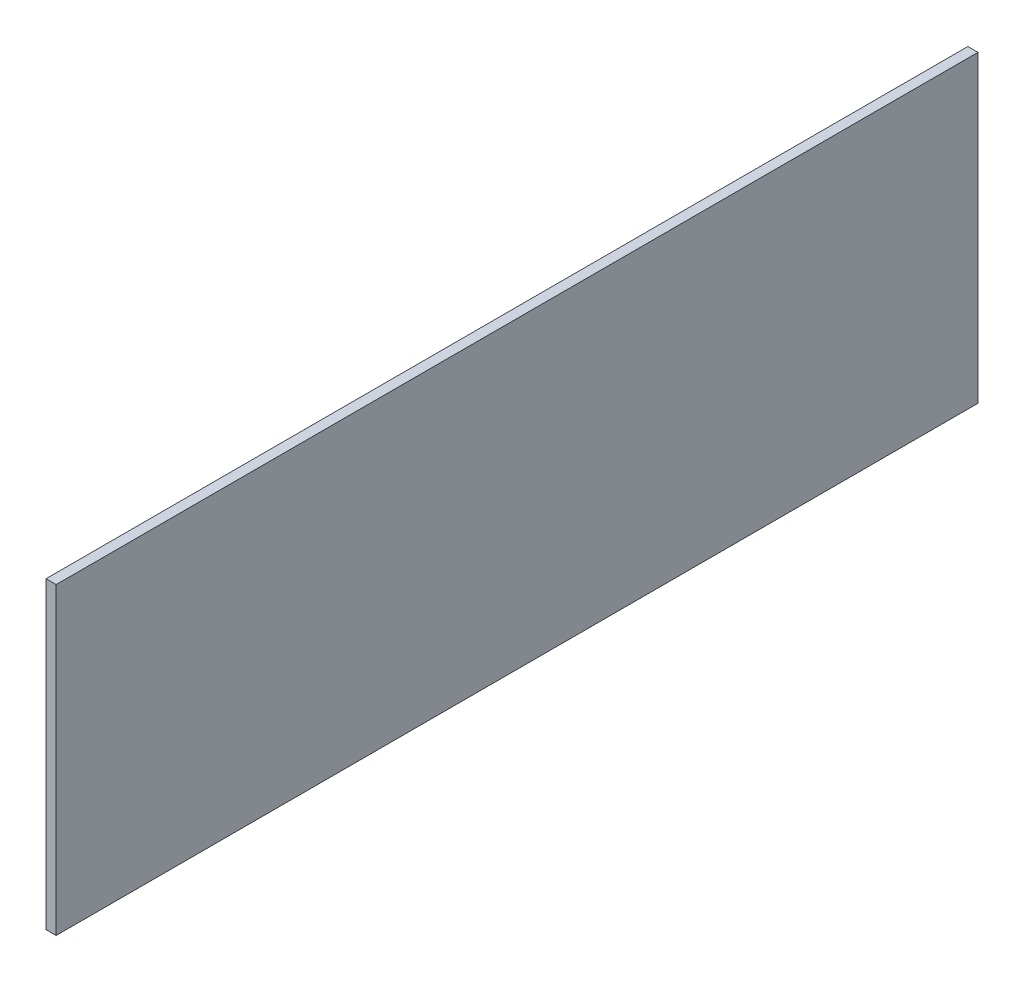
ISO-10303-21;
HEADER;
FILE_DESCRIPTION(('STEP AP214'),'2;1');
FILE_NAME('part.step','',(''),(''),'','','');
FILE_SCHEMA(('AUTOMOTIVE_DESIGN { 1 0 10303 214 1 1 1 1 }'));
ENDSEC;
DATA;
#1=APPLICATION_CONTEXT('core data for automotive mechanical design processes');
#2=APPLICATION_PROTOCOL_DEFINITION('international standard','automotive_design',2000,#1);
#3=PRODUCT_CONTEXT('',#1,'mechanical');
#4=PRODUCT('Part','Part','',(#3));
#5=PRODUCT_RELATED_PRODUCT_CATEGORY('part','',(#4));
#6=PRODUCT_DEFINITION_FORMATION('','',#4);
#7=PRODUCT_DEFINITION_CONTEXT('part definition',#1,'design');
#8=PRODUCT_DEFINITION('design','',#6,#7);
#9=PRODUCT_DEFINITION_SHAPE('','',#8);
#10=(LENGTH_UNIT() NAMED_UNIT(*) SI_UNIT(.MILLI.,.METRE.));
#11=(NAMED_UNIT(*) PLANE_ANGLE_UNIT() SI_UNIT($,.RADIAN.));
#12=(NAMED_UNIT(*) SI_UNIT($,.STERADIAN.) SOLID_ANGLE_UNIT());
#13=UNCERTAINTY_MEASURE_WITH_UNIT(LENGTH_MEASURE(1.E-05),#10,'distance_accuracy_value','');
#14=(GEOMETRIC_REPRESENTATION_CONTEXT(3) GLOBAL_UNCERTAINTY_ASSIGNED_CONTEXT((#13)) GLOBAL_UNIT_ASSIGNED_CONTEXT((#10,
#11,#12)) REPRESENTATION_CONTEXT('',''));
#15=CARTESIAN_POINT('',(0.,0.,0.));
#16=DIRECTION('',(0.,0.,1.));
#17=DIRECTION('',(1.,0.,0.));
#18=AXIS2_PLACEMENT_3D('',#15,#16,#17);
#19=CARTESIAN_POINT('',(62.,60.,-92.));
#20=DIRECTION('',(0.,0.,-1.));
#21=DIRECTION('',(0.,1.,0.));
#22=AXIS2_PLACEMENT_3D('',#19,#20,#21);
#23=PLANE('',#22);
#24=DIRECTION('',(0.,-1.,0.));
#25=VECTOR('',#24,1.);
#26=CARTESIAN_POINT('',(60.,60.,-92.));
#27=LINE('',#26,#25);
#28=CARTESIAN_POINT('',(60.,60.,-92.));
#29=VERTEX_POINT('',#28);
#30=CARTESIAN_POINT('',(60.,0.,-92.));
#31=VERTEX_POINT('',#30);
#32=EDGE_CURVE('E133',#29,#31,#27,.T.);
#33=ORIENTED_EDGE('',*,*,#32,.F.);
#34=DIRECTION('',(-1.,0.,0.));
#35=VECTOR('',#34,1.);
#36=CARTESIAN_POINT('',(62.,60.,-92.));
#37=LINE('',#36,#35);
#38=CARTESIAN_POINT('',(62.,60.,-92.));
#39=VERTEX_POINT('',#38);
#40=EDGE_CURVE('E12',#39,#29,#37,.T.);
#41=ORIENTED_EDGE('',*,*,#40,.F.);
#42=DIRECTION('',(0.,-1.,0.));
#43=VECTOR('',#42,1.);
#44=CARTESIAN_POINT('',(62.,60.,-92.));
#45=LINE('',#44,#43);
#46=CARTESIAN_POINT('',(62.,0.,-92.));
#47=VERTEX_POINT('',#46);
#48=EDGE_CURVE('E117',#39,#47,#45,.T.);
#49=ORIENTED_EDGE('',*,*,#48,.T.);
#50=DIRECTION('',(-1.,0.,0.));
#51=VECTOR('',#50,1.);
#52=CARTESIAN_POINT('',(62.,0.,-92.));
#53=LINE('',#52,#51);
#54=EDGE_CURVE('E47',#47,#31,#53,.T.);
#55=ORIENTED_EDGE('',*,*,#54,.T.);
#56=EDGE_LOOP('',(#33,#41,#49,#55));
#57=FACE_BOUND('',#56,.T.);
#58=ADVANCED_FACE('F43',(#57),#23,.T.);
#59=CARTESIAN_POINT('',(62.,60.,-92.));
#60=DIRECTION('',(0.,-1.,0.));
#61=DIRECTION('',(0.,0.,-1.));
#62=AXIS2_PLACEMENT_3D('',#59,#60,#61);
#63=PLANE('',#62);
#64=DIRECTION('',(0.,0.,1.));
#65=VECTOR('',#64,1.);
#66=CARTESIAN_POINT('',(60.,60.,-92.));
#67=LINE('',#66,#65);
#68=CARTESIAN_POINT('',(60.,60.,90.));
#69=VERTEX_POINT('',#68);
#70=EDGE_CURVE('E85',#29,#69,#67,.T.);
#71=ORIENTED_EDGE('',*,*,#70,.T.);
#72=DIRECTION('',(-1.,0.,0.));
#73=VECTOR('',#72,1.);
#74=CARTESIAN_POINT('',(62.,60.,90.));
#75=LINE('',#74,#73);
#76=CARTESIAN_POINT('',(62.,60.,90.));
#77=VERTEX_POINT('',#76);
#78=EDGE_CURVE('E55',#77,#69,#75,.T.);
#79=ORIENTED_EDGE('',*,*,#78,.F.);
#80=DIRECTION('',(0.,0.,1.));
#81=VECTOR('',#80,1.);
#82=CARTESIAN_POINT('',(62.,60.,-92.));
#83=LINE('',#82,#81);
#84=EDGE_CURVE('E104',#39,#77,#83,.T.);
#85=ORIENTED_EDGE('',*,*,#84,.F.);
#86=ORIENTED_EDGE('',*,*,#40,.T.);
#87=EDGE_LOOP('',(#71,#79,#85,#86));
#88=FACE_BOUND('',#87,.T.);
#89=ADVANCED_FACE('F159',(#88),#63,.F.);
#90=CARTESIAN_POINT('',(62.,60.,90.));
#91=DIRECTION('',(0.,0.,-1.));
#92=DIRECTION('',(-1.,0.,0.));
#93=AXIS2_PLACEMENT_3D('',#90,#91,#92);
#94=PLANE('',#93);
#95=DIRECTION('',(0.,-1.,0.));
#96=VECTOR('',#95,1.);
#97=CARTESIAN_POINT('',(60.,60.,90.));
#98=LINE('',#97,#96);
#99=CARTESIAN_POINT('',(60.,0.,90.));
#100=VERTEX_POINT('',#99);
#101=EDGE_CURVE('E112',#69,#100,#98,.T.);
#102=ORIENTED_EDGE('',*,*,#101,.T.);
#103=DIRECTION('',(-1.,0.,0.));
#104=VECTOR('',#103,1.);
#105=CARTESIAN_POINT('',(62.,0.,90.));
#106=LINE('',#105,#104);
#107=CARTESIAN_POINT('',(62.,0.,90.));
#108=VERTEX_POINT('',#107);
#109=EDGE_CURVE('E109',#108,#100,#106,.T.);
#110=ORIENTED_EDGE('',*,*,#109,.F.);
#111=DIRECTION('',(0.,-1.,0.));
#112=VECTOR('',#111,1.);
#113=CARTESIAN_POINT('',(62.,60.,90.));
#114=LINE('',#113,#112);
#115=EDGE_CURVE('E99',#77,#108,#114,.T.);
#116=ORIENTED_EDGE('',*,*,#115,.F.);
#117=ORIENTED_EDGE('',*,*,#78,.T.);
#118=EDGE_LOOP('',(#102,#110,#116,#117));
#119=FACE_BOUND('',#118,.T.);
#120=ADVANCED_FACE('F110',(#119),#94,.F.);
#121=CARTESIAN_POINT('',(62.,0.,-92.));
#122=DIRECTION('',(0.,-1.,0.));
#123=DIRECTION('',(0.,0.,-1.));
#124=AXIS2_PLACEMENT_3D('',#121,#122,#123);
#125=PLANE('',#124);
#126=DIRECTION('',(0.,0.,1.));
#127=VECTOR('',#126,1.);
#128=CARTESIAN_POINT('',(60.,0.,-92.));
#129=LINE('',#128,#127);
#130=EDGE_CURVE('E137',#31,#100,#129,.T.);
#131=ORIENTED_EDGE('',*,*,#130,.F.);
#132=ORIENTED_EDGE('',*,*,#54,.F.);
#133=DIRECTION('',(0.,0.,1.));
#134=VECTOR('',#133,1.);
#135=CARTESIAN_POINT('',(62.,0.,-92.));
#136=LINE('',#135,#134);
#137=EDGE_CURVE('E103',#47,#108,#136,.T.);
#138=ORIENTED_EDGE('',*,*,#137,.T.);
#139=ORIENTED_EDGE('',*,*,#109,.T.);
#140=EDGE_LOOP('',(#131,#132,#138,#139));
#141=FACE_BOUND('',#140,.T.);
#142=ADVANCED_FACE('F115',(#141),#125,.T.);
#143=CARTESIAN_POINT('',(62.,0.,0.));
#144=DIRECTION('',(-1.,0.,0.));
#145=DIRECTION('',(0.,0.,1.));
#146=AXIS2_PLACEMENT_3D('',#143,#144,#145);
#147=PLANE('',#146);
#148=ORIENTED_EDGE('',*,*,#48,.F.);
#149=ORIENTED_EDGE('',*,*,#84,.T.);
#150=ORIENTED_EDGE('',*,*,#115,.T.);
#151=ORIENTED_EDGE('',*,*,#137,.F.);
#152=EDGE_LOOP('',(#148,#149,#150,#151));
#153=FACE_BOUND('',#152,.T.);
#154=ADVANCED_FACE('F102',(#153),#147,.F.);
#155=CARTESIAN_POINT('',(60.,0.,0.));
#156=DIRECTION('',(-1.,0.,0.));
#157=DIRECTION('',(0.,0.,1.));
#158=AXIS2_PLACEMENT_3D('',#155,#156,#157);
#159=PLANE('',#158);
#160=ORIENTED_EDGE('',*,*,#32,.T.);
#161=ORIENTED_EDGE('',*,*,#130,.T.);
#162=ORIENTED_EDGE('',*,*,#101,.F.);
#163=ORIENTED_EDGE('',*,*,#70,.F.);
#164=EDGE_LOOP('',(#160,#161,#162,#163));
#165=FACE_BOUND('',#164,.T.);
#166=ADVANCED_FACE('F156',(#165),#159,.T.);
#167=CLOSED_SHELL('',(#58,#89,#120,#142,#154,#166));
#168=MANIFOLD_SOLID_BREP('B2',#167);
#169=ADVANCED_BREP_SHAPE_REPRESENTATION('',(#18,#168),#14);
#170=SHAPE_DEFINITION_REPRESENTATION(#9,#169);
ENDSEC;
END-ISO-10303-21;
